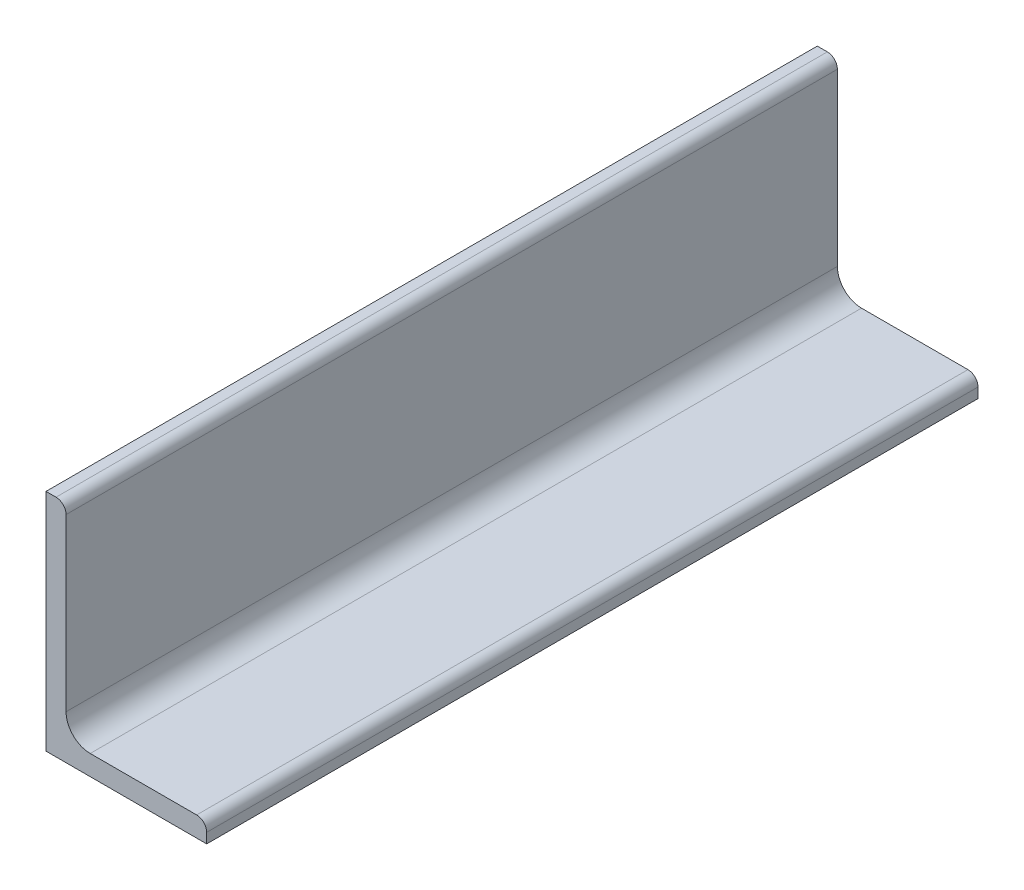
ISO-10303-21;
HEADER;
FILE_DESCRIPTION(('STEP AP214'),'2;1');
FILE_NAME('part.step','',(''),(''),'','','');
FILE_SCHEMA(('AUTOMOTIVE_DESIGN { 1 0 10303 214 1 1 1 1 }'));
ENDSEC;
DATA;
#1=APPLICATION_CONTEXT('core data for automotive mechanical design processes');
#2=APPLICATION_PROTOCOL_DEFINITION('international standard','automotive_design',2000,#1);
#3=PRODUCT_CONTEXT('',#1,'mechanical');
#4=PRODUCT('Part','Part','',(#3));
#5=PRODUCT_RELATED_PRODUCT_CATEGORY('part','',(#4));
#6=PRODUCT_DEFINITION_FORMATION('','',#4);
#7=PRODUCT_DEFINITION_CONTEXT('part definition',#1,'design');
#8=PRODUCT_DEFINITION('design','',#6,#7);
#9=PRODUCT_DEFINITION_SHAPE('','',#8);
#10=(LENGTH_UNIT() NAMED_UNIT(*) SI_UNIT(.MILLI.,.METRE.));
#11=(NAMED_UNIT(*) PLANE_ANGLE_UNIT() SI_UNIT($,.RADIAN.));
#12=(NAMED_UNIT(*) SI_UNIT($,.STERADIAN.) SOLID_ANGLE_UNIT());
#13=UNCERTAINTY_MEASURE_WITH_UNIT(LENGTH_MEASURE(1.E-05),#10,'distance_accuracy_value','');
#14=(GEOMETRIC_REPRESENTATION_CONTEXT(3) GLOBAL_UNCERTAINTY_ASSIGNED_CONTEXT((#13)) GLOBAL_UNIT_ASSIGNED_CONTEXT((#10,
#11,#12)) REPRESENTATION_CONTEXT('',''));
#15=CARTESIAN_POINT('',(0.,0.,0.));
#16=DIRECTION('',(0.,0.,1.));
#17=DIRECTION('',(1.,0.,0.));
#18=AXIS2_PLACEMENT_3D('',#15,#16,#17);
#19=CARTESIAN_POINT('',(0.897927251325018,89.7372005393545,304.8));
#20=DIRECTION('',(1.,0.,0.));
#21=DIRECTION('',(0.,0.,-1.));
#22=AXIS2_PLACEMENT_3D('',#19,#20,#21);
#23=PLANE('',#22);
#24=DIRECTION('',(0.,-1.,0.));
#25=VECTOR('',#24,1.);
#26=CARTESIAN_POINT('',(0.897927251325018,89.7372005393545,0.));
#27=LINE('',#26,#25);
#28=CARTESIAN_POINT('',(0.897927251325018,89.7372005393545,0.));
#29=VERTEX_POINT('',#28);
#30=CARTESIAN_POINT('',(0.897927251325018,0.837200539354535,0.));
#31=VERTEX_POINT('',#30);
#32=EDGE_CURVE('E135',#29,#31,#27,.T.);
#33=ORIENTED_EDGE('',*,*,#32,.T.);
#34=DIRECTION('',(0.,0.,-1.));
#35=VECTOR('',#34,1.);
#36=CARTESIAN_POINT('',(0.897927251325018,0.837200539354535,304.8));
#37=LINE('',#36,#35);
#38=CARTESIAN_POINT('',(0.897927251325018,0.837200539354535,304.8));
#39=VERTEX_POINT('',#38);
#40=EDGE_CURVE('E11',#39,#31,#37,.T.);
#41=ORIENTED_EDGE('',*,*,#40,.F.);
#42=DIRECTION('',(0.,-1.,0.));
#43=VECTOR('',#42,1.);
#44=CARTESIAN_POINT('',(0.897927251325018,89.7372005393545,304.8));
#45=LINE('',#44,#43);
#46=CARTESIAN_POINT('',(0.897927251325018,89.7372005393545,304.8));
#47=VERTEX_POINT('',#46);
#48=EDGE_CURVE('E151',#47,#39,#45,.T.);
#49=ORIENTED_EDGE('',*,*,#48,.F.);
#50=DIRECTION('',(0.,0.,-1.));
#51=VECTOR('',#50,1.);
#52=CARTESIAN_POINT('',(0.897927251325018,89.7372005393545,304.8));
#53=LINE('',#52,#51);
#54=EDGE_CURVE('E131',#47,#29,#53,.T.);
#55=ORIENTED_EDGE('',*,*,#54,.T.);
#56=EDGE_LOOP('',(#33,#41,#49,#55));
#57=FACE_BOUND('',#56,.T.);
#58=ADVANCED_FACE('F33',(#57),#23,.F.);
#59=CARTESIAN_POINT('',(0.897927251325018,0.837200539354535,304.8));
#60=DIRECTION('',(0.,1.,0.));
#61=DIRECTION('',(0.,0.,1.));
#62=AXIS2_PLACEMENT_3D('',#59,#60,#61);
#63=PLANE('',#62);
#64=DIRECTION('',(1.,0.,0.));
#65=VECTOR('',#64,1.);
#66=CARTESIAN_POINT('',(0.897927251325018,0.837200539354535,0.));
#67=LINE('',#66,#65);
#68=CARTESIAN_POINT('',(64.397927251325,0.837200539354535,0.));
#69=VERTEX_POINT('',#68);
#70=EDGE_CURVE('E138',#31,#69,#67,.T.);
#71=ORIENTED_EDGE('',*,*,#70,.T.);
#72=DIRECTION('',(0.,0.,-1.));
#73=VECTOR('',#72,1.);
#74=CARTESIAN_POINT('',(64.397927251325,0.837200539354535,304.8));
#75=LINE('',#74,#73);
#76=CARTESIAN_POINT('',(64.397927251325,0.837200539354535,304.8));
#77=VERTEX_POINT('',#76);
#78=EDGE_CURVE('E41',#77,#69,#75,.T.);
#79=ORIENTED_EDGE('',*,*,#78,.F.);
#80=DIRECTION('',(1.,0.,0.));
#81=VECTOR('',#80,1.);
#82=CARTESIAN_POINT('',(0.897927251325018,0.837200539354535,304.8));
#83=LINE('',#82,#81);
#84=EDGE_CURVE('E95',#39,#77,#83,.T.);
#85=ORIENTED_EDGE('',*,*,#84,.F.);
#86=ORIENTED_EDGE('',*,*,#40,.T.);
#87=EDGE_LOOP('',(#71,#79,#85,#86));
#88=FACE_BOUND('',#87,.T.);
#89=ADVANCED_FACE('F194',(#88),#63,.F.);
#90=CARTESIAN_POINT('',(64.397927251325,0.837200539354535,304.8));
#91=DIRECTION('',(-1.,0.,0.));
#92=DIRECTION('',(0.,0.,1.));
#93=AXIS2_PLACEMENT_3D('',#90,#91,#92);
#94=PLANE('',#93);
#95=DIRECTION('',(0.,1.,0.));
#96=VECTOR('',#95,1.);
#97=CARTESIAN_POINT('',(64.397927251325,0.837200539354535,0.));
#98=LINE('',#97,#96);
#99=CARTESIAN_POINT('',(64.397927251325,4.80595053935453,0.));
#100=VERTEX_POINT('',#99);
#101=EDGE_CURVE('E140',#69,#100,#98,.T.);
#102=ORIENTED_EDGE('',*,*,#101,.T.);
#103=DIRECTION('',(0.,0.,-1.));
#104=VECTOR('',#103,1.);
#105=CARTESIAN_POINT('',(64.397927251325,4.80595053935453,304.8));
#106=LINE('',#105,#104);
#107=CARTESIAN_POINT('',(64.397927251325,4.80595053935453,304.8));
#108=VERTEX_POINT('',#107);
#109=EDGE_CURVE('E161',#108,#100,#106,.T.);
#110=ORIENTED_EDGE('',*,*,#109,.F.);
#111=DIRECTION('',(0.,1.,0.));
#112=VECTOR('',#111,1.);
#113=CARTESIAN_POINT('',(64.397927251325,0.837200539354535,304.8));
#114=LINE('',#113,#112);
#115=EDGE_CURVE('E169',#77,#108,#114,.T.);
#116=ORIENTED_EDGE('',*,*,#115,.F.);
#117=ORIENTED_EDGE('',*,*,#78,.T.);
#118=EDGE_LOOP('',(#102,#110,#116,#117));
#119=FACE_BOUND('',#118,.T.);
#120=ADVANCED_FACE('F167',(#119),#94,.F.);
#121=CARTESIAN_POINT('',(60.429177251325,4.80595053935453,304.8));
#122=DIRECTION('',(0.,0.,-1.));
#123=DIRECTION('',(-1.,0.,0.));
#124=AXIS2_PLACEMENT_3D('',#121,#122,#123);
#125=CYLINDRICAL_SURFACE('',#124,3.96875);
#126=CARTESIAN_POINT('',(60.429177251325,4.80595053935453,0.));
#127=DIRECTION('',(0.,0.,1.));
#128=DIRECTION('',(1.,0.,0.));
#129=AXIS2_PLACEMENT_3D('',#126,#127,#128);
#130=CIRCLE('',#129,3.96875);
#131=CARTESIAN_POINT('',(60.429177251325,8.77470053935453,0.));
#132=VERTEX_POINT('',#131);
#133=EDGE_CURVE('E142',#100,#132,#130,.T.);
#134=ORIENTED_EDGE('',*,*,#133,.T.);
#135=DIRECTION('',(0.,0.,-1.));
#136=VECTOR('',#135,1.);
#137=CARTESIAN_POINT('',(60.429177251325,8.77470053935453,304.8));
#138=LINE('',#137,#136);
#139=CARTESIAN_POINT('',(60.429177251325,8.77470053935453,304.8));
#140=VERTEX_POINT('',#139);
#141=EDGE_CURVE('E158',#140,#132,#138,.T.);
#142=ORIENTED_EDGE('',*,*,#141,.F.);
#143=CARTESIAN_POINT('',(60.429177251325,4.80595053935453,304.8));
#144=DIRECTION('',(0.,0.,1.));
#145=DIRECTION('',(1.,0.,0.));
#146=AXIS2_PLACEMENT_3D('',#143,#144,#145);
#147=CIRCLE('',#146,3.96875);
#148=EDGE_CURVE('E185',#108,#140,#147,.T.);
#149=ORIENTED_EDGE('',*,*,#148,.F.);
#150=ORIENTED_EDGE('',*,*,#109,.T.);
#151=EDGE_LOOP('',(#134,#142,#149,#150));
#152=FACE_BOUND('',#151,.T.);
#153=ADVANCED_FACE('F178',(#152),#125,.T.);
#154=CARTESIAN_POINT('',(60.429177251325,8.77470053935454,304.8));
#155=DIRECTION('',(0.,-1.,0.));
#156=DIRECTION('',(0.,0.,-1.));
#157=AXIS2_PLACEMENT_3D('',#154,#155,#156);
#158=PLANE('',#157);
#159=DIRECTION('',(-1.,0.,0.));
#160=VECTOR('',#159,1.);
#161=CARTESIAN_POINT('',(60.429177251325,8.77470053935454,0.));
#162=LINE('',#161,#160);
#163=CARTESIAN_POINT('',(18.360427251325,8.77470053935454,0.));
#164=VERTEX_POINT('',#163);
#165=EDGE_CURVE('E144',#132,#164,#162,.T.);
#166=ORIENTED_EDGE('',*,*,#165,.T.);
#167=DIRECTION('',(0.,0.,-1.));
#168=VECTOR('',#167,1.);
#169=CARTESIAN_POINT('',(18.360427251325,8.77470053935454,304.8));
#170=LINE('',#169,#168);
#171=CARTESIAN_POINT('',(18.360427251325,8.77470053935454,304.8));
#172=VERTEX_POINT('',#171);
#173=EDGE_CURVE('E155',#172,#164,#170,.T.);
#174=ORIENTED_EDGE('',*,*,#173,.F.);
#175=DIRECTION('',(-1.,0.,0.));
#176=VECTOR('',#175,1.);
#177=CARTESIAN_POINT('',(60.429177251325,8.77470053935454,304.8));
#178=LINE('',#177,#176);
#179=EDGE_CURVE('E184',#140,#172,#178,.T.);
#180=ORIENTED_EDGE('',*,*,#179,.F.);
#181=ORIENTED_EDGE('',*,*,#141,.T.);
#182=EDGE_LOOP('',(#166,#174,#180,#181));
#183=FACE_BOUND('',#182,.T.);
#184=ADVANCED_FACE('F182',(#183),#158,.F.);
#185=CARTESIAN_POINT('',(18.360427251325,18.2997005393545,304.8));
#186=DIRECTION('',(0.,0.,-1.));
#187=DIRECTION('',(-1.,0.,0.));
#188=AXIS2_PLACEMENT_3D('',#185,#186,#187);
#189=CYLINDRICAL_SURFACE('',#188,9.52499999999999);
#190=CARTESIAN_POINT('',(18.360427251325,18.2997005393545,0.));
#191=DIRECTION('',(0.,0.,-1.));
#192=DIRECTION('',(1.,0.,0.));
#193=AXIS2_PLACEMENT_3D('',#190,#191,#192);
#194=CIRCLE('',#193,9.52499999999999);
#195=CARTESIAN_POINT('',(8.83542725132502,18.2997005393545,0.));
#196=VERTEX_POINT('',#195);
#197=EDGE_CURVE('E146',#164,#196,#194,.T.);
#198=ORIENTED_EDGE('',*,*,#197,.T.);
#199=DIRECTION('',(0.,0.,-1.));
#200=VECTOR('',#199,1.);
#201=CARTESIAN_POINT('',(8.83542725132502,18.2997005393545,304.8));
#202=LINE('',#201,#200);
#203=CARTESIAN_POINT('',(8.83542725132502,18.2997005393545,304.8));
#204=VERTEX_POINT('',#203);
#205=EDGE_CURVE('E126',#204,#196,#202,.T.);
#206=ORIENTED_EDGE('',*,*,#205,.F.);
#207=CARTESIAN_POINT('',(18.360427251325,18.2997005393545,304.8));
#208=DIRECTION('',(0.,0.,-1.));
#209=DIRECTION('',(1.,0.,0.));
#210=AXIS2_PLACEMENT_3D('',#207,#208,#209);
#211=CIRCLE('',#210,9.52499999999999);
#212=EDGE_CURVE('E117',#172,#204,#211,.T.);
#213=ORIENTED_EDGE('',*,*,#212,.F.);
#214=ORIENTED_EDGE('',*,*,#173,.T.);
#215=EDGE_LOOP('',(#198,#206,#213,#214));
#216=FACE_BOUND('',#215,.T.);
#217=ADVANCED_FACE('F206',(#216),#189,.F.);
#218=CARTESIAN_POINT('',(8.83542725132502,18.2997005393545,304.8));
#219=DIRECTION('',(-1.,0.,0.));
#220=DIRECTION('',(0.,0.,1.));
#221=AXIS2_PLACEMENT_3D('',#218,#219,#220);
#222=PLANE('',#221);
#223=DIRECTION('',(0.,1.,0.));
#224=VECTOR('',#223,1.);
#225=CARTESIAN_POINT('',(8.83542725132502,18.2997005393545,0.));
#226=LINE('',#225,#224);
#227=CARTESIAN_POINT('',(8.83542725132502,85.7684505393545,0.));
#228=VERTEX_POINT('',#227);
#229=EDGE_CURVE('E125',#196,#228,#226,.T.);
#230=ORIENTED_EDGE('',*,*,#229,.T.);
#231=DIRECTION('',(0.,0.,-1.));
#232=VECTOR('',#231,1.);
#233=CARTESIAN_POINT('',(8.83542725132502,85.7684505393545,304.8));
#234=LINE('',#233,#232);
#235=CARTESIAN_POINT('',(8.83542725132502,85.7684505393545,304.8));
#236=VERTEX_POINT('',#235);
#237=EDGE_CURVE('E122',#236,#228,#234,.T.);
#238=ORIENTED_EDGE('',*,*,#237,.F.);
#239=DIRECTION('',(0.,1.,0.));
#240=VECTOR('',#239,1.);
#241=CARTESIAN_POINT('',(8.83542725132502,18.2997005393545,304.8));
#242=LINE('',#241,#240);
#243=EDGE_CURVE('E111',#204,#236,#242,.T.);
#244=ORIENTED_EDGE('',*,*,#243,.F.);
#245=ORIENTED_EDGE('',*,*,#205,.T.);
#246=EDGE_LOOP('',(#230,#238,#244,#245));
#247=FACE_BOUND('',#246,.T.);
#248=ADVANCED_FACE('F123',(#247),#222,.F.);
#249=CARTESIAN_POINT('',(4.86667725132502,85.7684505393545,304.8));
#250=DIRECTION('',(0.,0.,-1.));
#251=DIRECTION('',(-1.,0.,0.));
#252=AXIS2_PLACEMENT_3D('',#249,#250,#251);
#253=CYLINDRICAL_SURFACE('',#252,3.96875);
#254=CARTESIAN_POINT('',(4.86667725132502,85.7684505393545,0.));
#255=DIRECTION('',(0.,0.,1.));
#256=DIRECTION('',(1.,0.,0.));
#257=AXIS2_PLACEMENT_3D('',#254,#255,#256);
#258=CIRCLE('',#257,3.96875);
#259=CARTESIAN_POINT('',(4.86667725132502,89.7372005393545,0.));
#260=VERTEX_POINT('',#259);
#261=EDGE_CURVE('E81',#228,#260,#258,.T.);
#262=ORIENTED_EDGE('',*,*,#261,.T.);
#263=DIRECTION('',(0.,0.,-1.));
#264=VECTOR('',#263,1.);
#265=CARTESIAN_POINT('',(4.86667725132502,89.7372005393545,304.8));
#266=LINE('',#265,#264);
#267=CARTESIAN_POINT('',(4.86667725132502,89.7372005393545,304.8));
#268=VERTEX_POINT('',#267);
#269=EDGE_CURVE('E127',#268,#260,#266,.T.);
#270=ORIENTED_EDGE('',*,*,#269,.F.);
#271=CARTESIAN_POINT('',(4.86667725132502,85.7684505393545,304.8));
#272=DIRECTION('',(0.,0.,1.));
#273=DIRECTION('',(1.,0.,0.));
#274=AXIS2_PLACEMENT_3D('',#271,#272,#273);
#275=CIRCLE('',#274,3.96875);
#276=EDGE_CURVE('E115',#236,#268,#275,.T.);
#277=ORIENTED_EDGE('',*,*,#276,.F.);
#278=ORIENTED_EDGE('',*,*,#237,.T.);
#279=EDGE_LOOP('',(#262,#270,#277,#278));
#280=FACE_BOUND('',#279,.T.);
#281=ADVANCED_FACE('F129',(#280),#253,.T.);
#282=CARTESIAN_POINT('',(4.86667725132502,89.7372005393545,304.8));
#283=DIRECTION('',(0.,-1.,0.));
#284=DIRECTION('',(0.,0.,-1.));
#285=AXIS2_PLACEMENT_3D('',#282,#283,#284);
#286=PLANE('',#285);
#287=DIRECTION('',(-1.,0.,0.));
#288=VECTOR('',#287,1.);
#289=CARTESIAN_POINT('',(4.86667725132502,89.7372005393545,0.));
#290=LINE('',#289,#288);
#291=EDGE_CURVE('E87',#260,#29,#290,.T.);
#292=ORIENTED_EDGE('',*,*,#291,.T.);
#293=ORIENTED_EDGE('',*,*,#54,.F.);
#294=DIRECTION('',(-1.,0.,0.));
#295=VECTOR('',#294,1.);
#296=CARTESIAN_POINT('',(4.86667725132502,89.7372005393545,304.8));
#297=LINE('',#296,#295);
#298=EDGE_CURVE('E49',#268,#47,#297,.T.);
#299=ORIENTED_EDGE('',*,*,#298,.F.);
#300=ORIENTED_EDGE('',*,*,#269,.T.);
#301=EDGE_LOOP('',(#292,#293,#299,#300));
#302=FACE_BOUND('',#301,.T.);
#303=ADVANCED_FACE('F214',(#302),#286,.F.);
#304=CARTESIAN_POINT('',(60.429177251325,4.80595053935453,304.8));
#305=DIRECTION('',(0.,0.,1.));
#306=DIRECTION('',(1.,0.,0.));
#307=AXIS2_PLACEMENT_3D('',#304,#305,#306);
#308=PLANE('',#307);
#309=ORIENTED_EDGE('',*,*,#48,.T.);
#310=ORIENTED_EDGE('',*,*,#84,.T.);
#311=ORIENTED_EDGE('',*,*,#115,.T.);
#312=ORIENTED_EDGE('',*,*,#148,.T.);
#313=ORIENTED_EDGE('',*,*,#179,.T.);
#314=ORIENTED_EDGE('',*,*,#212,.T.);
#315=ORIENTED_EDGE('',*,*,#243,.T.);
#316=ORIENTED_EDGE('',*,*,#276,.T.);
#317=ORIENTED_EDGE('',*,*,#298,.T.);
#318=EDGE_LOOP('',(#309,#310,#311,#312,#313,#314,#315,#316,#317));
#319=FACE_BOUND('',#318,.T.);
#320=ADVANCED_FACE('F113',(#319),#308,.T.);
#321=CARTESIAN_POINT('',(60.429177251325,4.80595053935453,0.));
#322=DIRECTION('',(0.,0.,1.));
#323=DIRECTION('',(1.,0.,0.));
#324=AXIS2_PLACEMENT_3D('',#321,#322,#323);
#325=PLANE('',#324);
#326=ORIENTED_EDGE('',*,*,#32,.F.);
#327=ORIENTED_EDGE('',*,*,#291,.F.);
#328=ORIENTED_EDGE('',*,*,#261,.F.);
#329=ORIENTED_EDGE('',*,*,#229,.F.);
#330=ORIENTED_EDGE('',*,*,#197,.F.);
#331=ORIENTED_EDGE('',*,*,#165,.F.);
#332=ORIENTED_EDGE('',*,*,#133,.F.);
#333=ORIENTED_EDGE('',*,*,#101,.F.);
#334=ORIENTED_EDGE('',*,*,#70,.F.);
#335=EDGE_LOOP('',(#326,#327,#328,#329,#330,#331,#332,#333,#334));
#336=FACE_BOUND('',#335,.T.);
#337=ADVANCED_FACE('F173',(#336),#325,.F.);
#338=CLOSED_SHELL('',(#58,#89,#120,#153,#184,#217,#248,#281,#303,#320,#337));
#339=MANIFOLD_SOLID_BREP('B2',#338);
#340=ADVANCED_BREP_SHAPE_REPRESENTATION('',(#18,#339),#14);
#341=SHAPE_DEFINITION_REPRESENTATION(#9,#340);
ENDSEC;
END-ISO-10303-21;
